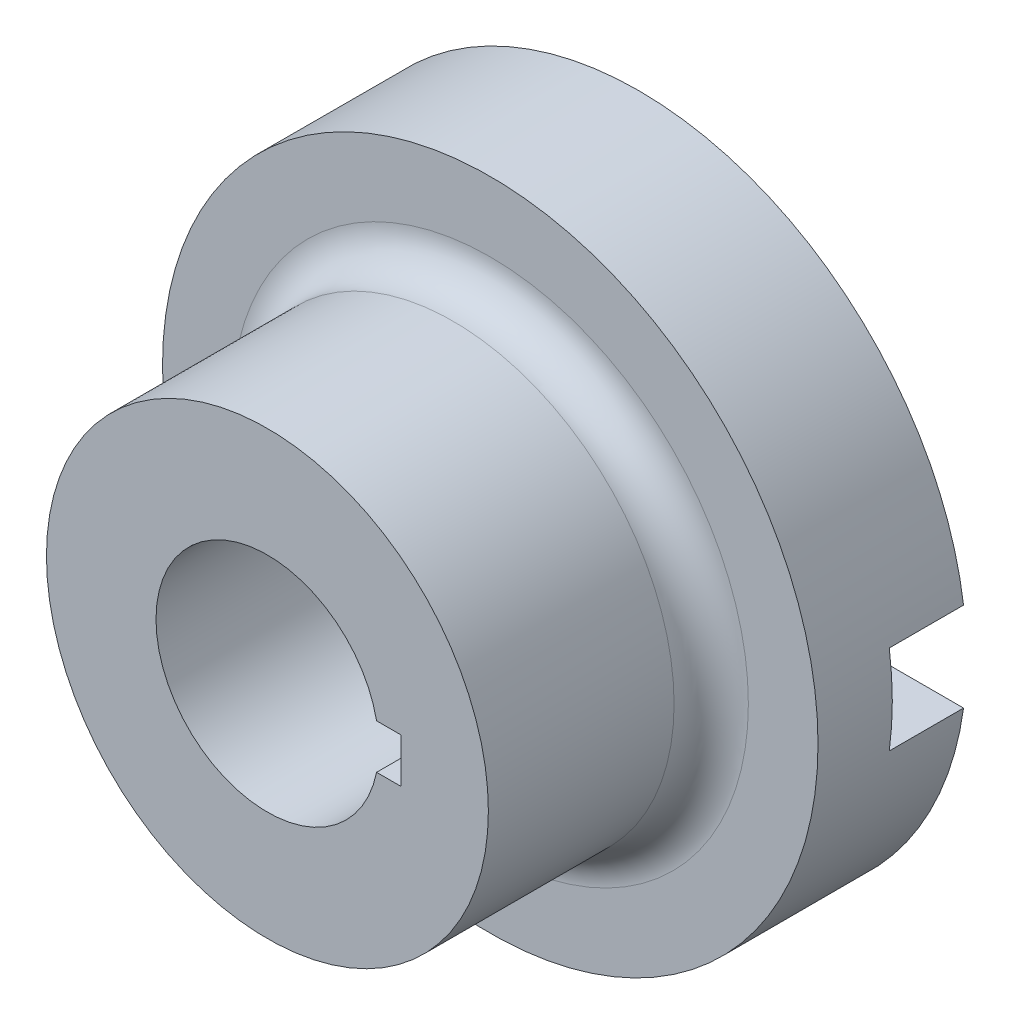
ISO-10303-21;
HEADER;
FILE_DESCRIPTION(('STEP AP214'),'2;1');
FILE_NAME('part.step','',(''),(''),'','','');
FILE_SCHEMA(('AUTOMOTIVE_DESIGN { 1 0 10303 214 1 1 1 1 }'));
ENDSEC;
DATA;
#1=APPLICATION_CONTEXT('core data for automotive mechanical design processes');
#2=APPLICATION_PROTOCOL_DEFINITION('international standard','automotive_design',2000,#1);
#3=PRODUCT_CONTEXT('',#1,'mechanical');
#4=PRODUCT('Part','Part','',(#3));
#5=PRODUCT_RELATED_PRODUCT_CATEGORY('part','',(#4));
#6=PRODUCT_DEFINITION_FORMATION('','',#4);
#7=PRODUCT_DEFINITION_CONTEXT('part definition',#1,'design');
#8=PRODUCT_DEFINITION('design','',#6,#7);
#9=PRODUCT_DEFINITION_SHAPE('','',#8);
#10=(LENGTH_UNIT() NAMED_UNIT(*) SI_UNIT(.MILLI.,.METRE.));
#11=(NAMED_UNIT(*) PLANE_ANGLE_UNIT() SI_UNIT($,.RADIAN.));
#12=(NAMED_UNIT(*) SI_UNIT($,.STERADIAN.) SOLID_ANGLE_UNIT());
#13=UNCERTAINTY_MEASURE_WITH_UNIT(LENGTH_MEASURE(1.E-05),#10,'distance_accuracy_value','');
#14=(GEOMETRIC_REPRESENTATION_CONTEXT(3) GLOBAL_UNCERTAINTY_ASSIGNED_CONTEXT((#13)) GLOBAL_UNIT_ASSIGNED_CONTEXT((#10,
#11,#12)) REPRESENTATION_CONTEXT('',''));
#15=CARTESIAN_POINT('',(0.,0.,0.));
#16=DIRECTION('',(0.,0.,1.));
#17=DIRECTION('',(1.,0.,0.));
#18=AXIS2_PLACEMENT_3D('',#15,#16,#17);
#19=CARTESIAN_POINT('',(0.,15.,0.));
#20=DIRECTION('',(0.,0.,-1.));
#21=DIRECTION('',(-1.,0.,0.));
#22=AXIS2_PLACEMENT_3D('',#19,#20,#21);
#23=PLANE('',#22);
#24=DIRECTION('',(-1.,0.,0.));
#25=VECTOR('',#24,1.);
#26=CARTESIAN_POINT('',(59.157364073144,-6.,0.));
#27=LINE('',#26,#25);
#28=CARTESIAN_POINT('',(43.7145832655232,-6.,0.));
#29=VERTEX_POINT('',#28);
#30=CARTESIAN_POINT('',(13.7477270848675,-6.,0.));
#31=VERTEX_POINT('',#30);
#32=EDGE_CURVE('E153',#29,#31,#27,.T.);
#33=ORIENTED_EDGE('',*,*,#32,.F.);
#34=CARTESIAN_POINT('',(0.,0.,0.));
#35=DIRECTION('',(0.,0.,-1.));
#36=DIRECTION('',(-1.,0.,0.));
#37=AXIS2_PLACEMENT_3D('',#34,#35,#36);
#38=CIRCLE('',#37,44.1244239631336);
#39=CARTESIAN_POINT('',(-43.7145832655232,-6.,0.));
#40=VERTEX_POINT('',#39);
#41=EDGE_CURVE('E183',#29,#40,#38,.T.);
#42=ORIENTED_EDGE('',*,*,#41,.T.);
#43=CARTESIAN_POINT('',(-13.7477270848675,-6.,0.));
#44=VERTEX_POINT('',#43);
#45=EDGE_CURVE('E159',#44,#40,#27,.T.);
#46=ORIENTED_EDGE('',*,*,#45,.F.);
#47=CARTESIAN_POINT('',(0.,0.,0.));
#48=DIRECTION('',(0.,0.,-1.));
#49=DIRECTION('',(-1.,0.,0.));
#50=AXIS2_PLACEMENT_3D('',#47,#48,#49);
#51=CIRCLE('',#50,15.);
#52=EDGE_CURVE('E187',#31,#44,#51,.T.);
#53=ORIENTED_EDGE('',*,*,#52,.F.);
#54=EDGE_LOOP('',(#33,#42,#46,#53));
#55=FACE_BOUND('',#54,.T.);
#56=ADVANCED_FACE('F33',(#55),#23,.T.);
#57=CARTESIAN_POINT('',(0.,0.,0.));
#58=DIRECTION('',(0.,0.,-1.));
#59=DIRECTION('',(-1.,0.,0.));
#60=AXIS2_PLACEMENT_3D('',#57,#58,#59);
#61=CYLINDRICAL_SURFACE('',#60,15.);
#62=DIRECTION('',(0.,0.,-1.));
#63=VECTOR('',#62,1.);
#64=CARTESIAN_POINT('',(14.6969384566991,3.,0.));
#65=LINE('',#64,#63);
#66=CARTESIAN_POINT('',(14.6969384566991,3.,50.));
#67=VERTEX_POINT('',#66);
#68=CARTESIAN_POINT('',(14.6969384566991,3.,10.));
#69=VERTEX_POINT('',#68);
#70=EDGE_CURVE('E148',#67,#69,#65,.T.);
#71=ORIENTED_EDGE('',*,*,#70,.F.);
#72=CARTESIAN_POINT('',(0.,0.,50.));
#73=DIRECTION('',(0.,0.,-1.));
#74=DIRECTION('',(-1.,0.,0.));
#75=AXIS2_PLACEMENT_3D('',#72,#73,#74);
#76=CIRCLE('',#75,15.);
#77=CARTESIAN_POINT('',(14.6969384566991,-3.,50.));
#78=VERTEX_POINT('',#77);
#79=EDGE_CURVE('E175',#78,#67,#76,.T.);
#80=ORIENTED_EDGE('',*,*,#79,.F.);
#81=DIRECTION('',(0.,0.,-1.));
#82=VECTOR('',#81,1.);
#83=CARTESIAN_POINT('',(14.6969384566991,-3.,0.));
#84=LINE('',#83,#82);
#85=CARTESIAN_POINT('',(14.6969384566991,-3.,10.));
#86=VERTEX_POINT('',#85);
#87=EDGE_CURVE('E136',#86,#78,#84,.F.);
#88=ORIENTED_EDGE('',*,*,#87,.F.);
#89=CARTESIAN_POINT('',(0.,0.,10.));
#90=DIRECTION('',(0.,0.,-1.));
#91=DIRECTION('',(-1.,0.,0.));
#92=AXIS2_PLACEMENT_3D('',#89,#90,#91);
#93=CIRCLE('',#92,15.);
#94=CARTESIAN_POINT('',(13.7477270848675,-6.,10.));
#95=VERTEX_POINT('',#94);
#96=EDGE_CURVE('E164',#86,#95,#93,.T.);
#97=ORIENTED_EDGE('',*,*,#96,.T.);
#98=DIRECTION('',(0.,0.,-1.));
#99=VECTOR('',#98,1.);
#100=CARTESIAN_POINT('',(13.7477270848675,-6.,0.));
#101=LINE('',#100,#99);
#102=EDGE_CURVE('E170',#31,#95,#101,.F.);
#103=ORIENTED_EDGE('',*,*,#102,.F.);
#104=ORIENTED_EDGE('',*,*,#52,.T.);
#105=DIRECTION('',(0.,0.,-1.));
#106=VECTOR('',#105,1.);
#107=CARTESIAN_POINT('',(-13.7477270848675,-6.,0.));
#108=LINE('',#107,#106);
#109=CARTESIAN_POINT('',(-13.7477270848675,-6.,10.));
#110=VERTEX_POINT('',#109);
#111=EDGE_CURVE('E173',#110,#44,#108,.T.);
#112=ORIENTED_EDGE('',*,*,#111,.F.);
#113=CARTESIAN_POINT('',(-13.7477270848675,6.,10.));
#114=VERTEX_POINT('',#113);
#115=EDGE_CURVE('E161',#110,#114,#93,.T.);
#116=ORIENTED_EDGE('',*,*,#115,.T.);
#117=DIRECTION('',(0.,0.,-1.));
#118=VECTOR('',#117,1.);
#119=CARTESIAN_POINT('',(-13.7477270848675,6.,0.));
#120=LINE('',#119,#118);
#121=CARTESIAN_POINT('',(-13.7477270848675,6.,0.));
#122=VERTEX_POINT('',#121);
#123=EDGE_CURVE('E166',#122,#114,#120,.F.);
#124=ORIENTED_EDGE('',*,*,#123,.F.);
#125=CARTESIAN_POINT('',(13.7477270848675,6.,0.));
#126=VERTEX_POINT('',#125);
#127=EDGE_CURVE('E188',#122,#126,#51,.T.);
#128=ORIENTED_EDGE('',*,*,#127,.T.);
#129=DIRECTION('',(0.,0.,-1.));
#130=VECTOR('',#129,1.);
#131=CARTESIAN_POINT('',(13.7477270848675,6.,0.));
#132=LINE('',#131,#130);
#133=CARTESIAN_POINT('',(13.7477270848675,6.,10.));
#134=VERTEX_POINT('',#133);
#135=EDGE_CURVE('E168',#134,#126,#132,.T.);
#136=ORIENTED_EDGE('',*,*,#135,.F.);
#137=EDGE_CURVE('E165',#134,#69,#93,.T.);
#138=ORIENTED_EDGE('',*,*,#137,.T.);
#139=EDGE_LOOP('',(#71,#80,#88,#97,#103,#104,#112,#116,#124,#128,#136,#138));
#140=FACE_BOUND('',#139,.T.);
#141=ADVANCED_FACE('F222',(#140),#61,.F.);
#142=DIRECTION('',(1.,0.,0.));
#143=VECTOR('',#142,1.);
#144=CARTESIAN_POINT('',(59.157364073144,6.,0.));
#145=LINE('',#144,#143);
#146=CARTESIAN_POINT('',(-43.7145832655232,6.,0.));
#147=VERTEX_POINT('',#146);
#148=EDGE_CURVE('E158',#147,#122,#145,.T.);
#149=ORIENTED_EDGE('',*,*,#148,.F.);
#150=CARTESIAN_POINT('',(43.7145832655232,6.,0.));
#151=VERTEX_POINT('',#150);
#152=EDGE_CURVE('E184',#147,#151,#38,.T.);
#153=ORIENTED_EDGE('',*,*,#152,.T.);
#154=EDGE_CURVE('E150',#126,#151,#145,.T.);
#155=ORIENTED_EDGE('',*,*,#154,.F.);
#156=ORIENTED_EDGE('',*,*,#127,.F.);
#157=EDGE_LOOP('',(#149,#153,#155,#156));
#158=FACE_BOUND('',#157,.T.);
#159=ADVANCED_FACE('F225',(#158),#23,.T.);
#160=CARTESIAN_POINT('',(0.,0.,0.));
#161=DIRECTION('',(0.,0.,-1.));
#162=DIRECTION('',(-1.,0.,0.));
#163=AXIS2_PLACEMENT_3D('',#160,#161,#162);
#164=CYLINDRICAL_SURFACE('',#163,44.1244239631336);
#165=DIRECTION('',(0.,0.,-1.));
#166=VECTOR('',#165,1.);
#167=CARTESIAN_POINT('',(43.7145832655232,-6.,0.));
#168=LINE('',#167,#166);
#169=CARTESIAN_POINT('',(43.7145832655232,-6.,10.));
#170=VERTEX_POINT('',#169);
#171=EDGE_CURVE('E202',#170,#29,#168,.T.);
#172=ORIENTED_EDGE('',*,*,#171,.F.);
#173=CARTESIAN_POINT('',(0.,0.,10.));
#174=DIRECTION('',(0.,0.,-1.));
#175=DIRECTION('',(-1.,0.,0.));
#176=AXIS2_PLACEMENT_3D('',#173,#174,#175);
#177=CIRCLE('',#176,44.1244239631336);
#178=CARTESIAN_POINT('',(43.7145832655232,6.,10.));
#179=VERTEX_POINT('',#178);
#180=EDGE_CURVE('E195',#170,#179,#177,.F.);
#181=ORIENTED_EDGE('',*,*,#180,.T.);
#182=DIRECTION('',(0.,0.,-1.));
#183=VECTOR('',#182,1.);
#184=CARTESIAN_POINT('',(43.7145832655232,6.,0.));
#185=LINE('',#184,#183);
#186=EDGE_CURVE('E200',#151,#179,#185,.F.);
#187=ORIENTED_EDGE('',*,*,#186,.F.);
#188=ORIENTED_EDGE('',*,*,#152,.F.);
#189=DIRECTION('',(0.,0.,-1.));
#190=VECTOR('',#189,1.);
#191=CARTESIAN_POINT('',(-43.7145832655232,6.,0.));
#192=LINE('',#191,#190);
#193=CARTESIAN_POINT('',(-43.7145832655232,6.,10.));
#194=VERTEX_POINT('',#193);
#195=EDGE_CURVE('E194',#194,#147,#192,.T.);
#196=ORIENTED_EDGE('',*,*,#195,.F.);
#197=CARTESIAN_POINT('',(-43.7145832655232,-6.,10.));
#198=VERTEX_POINT('',#197);
#199=EDGE_CURVE('E191',#194,#198,#177,.F.);
#200=ORIENTED_EDGE('',*,*,#199,.T.);
#201=DIRECTION('',(0.,0.,-1.));
#202=VECTOR('',#201,1.);
#203=CARTESIAN_POINT('',(-43.7145832655232,-6.,0.));
#204=LINE('',#203,#202);
#205=EDGE_CURVE('E197',#40,#198,#204,.F.);
#206=ORIENTED_EDGE('',*,*,#205,.F.);
#207=ORIENTED_EDGE('',*,*,#41,.F.);
#208=EDGE_LOOP('',(#172,#181,#187,#188,#196,#200,#206,#207));
#209=FACE_BOUND('',#208,.T.);
#210=CARTESIAN_POINT('',(0.,0.,20.));
#211=DIRECTION('',(0.,0.,-1.));
#212=DIRECTION('',(-1.,0.,0.));
#213=AXIS2_PLACEMENT_3D('',#210,#211,#212);
#214=CIRCLE('',#213,44.1244239631336);
#215=CARTESIAN_POINT('',(-44.1244239631336,0.,20.));
#216=VERTEX_POINT('',#215);
#217=EDGE_CURVE('E180',#216,#216,#214,.T.);
#218=ORIENTED_EDGE('',*,*,#217,.T.);
#219=EDGE_LOOP('',(#218));
#220=FACE_BOUND('',#219,.T.);
#221=ADVANCED_FACE('F233',(#209,#220),#164,.T.);
#222=CARTESIAN_POINT('',(0.,44.1244239631336,20.));
#223=DIRECTION('',(0.,0.,1.));
#224=DIRECTION('',(1.,0.,0.));
#225=AXIS2_PLACEMENT_3D('',#222,#223,#224);
#226=PLANE('',#225);
#227=CARTESIAN_POINT('',(0.,0.,20.));
#228=DIRECTION('',(0.,0.,1.));
#229=DIRECTION('',(1.,0.,0.));
#230=AXIS2_PLACEMENT_3D('',#227,#228,#229);
#231=CIRCLE('',#230,34.7465437788018);
#232=CARTESIAN_POINT('',(34.7465437788018,0.,20.));
#233=VERTEX_POINT('',#232);
#234=EDGE_CURVE('E41',#233,#233,#231,.F.);
#235=ORIENTED_EDGE('',*,*,#234,.T.);
#236=EDGE_LOOP('',(#235));
#237=FACE_BOUND('',#236,.T.);
#238=ORIENTED_EDGE('',*,*,#217,.F.);
#239=EDGE_LOOP('',(#238));
#240=FACE_BOUND('',#239,.T.);
#241=ADVANCED_FACE('F211',(#237,#240),#226,.T.);
#242=CARTESIAN_POINT('',(0.,0.,0.));
#243=DIRECTION('',(0.,0.,-1.));
#244=DIRECTION('',(-1.,0.,0.));
#245=AXIS2_PLACEMENT_3D('',#242,#243,#244);
#246=CYLINDRICAL_SURFACE('',#245,29.7465437788018);
#247=CARTESIAN_POINT('',(0.,0.,25.));
#248=DIRECTION('',(0.,0.,1.));
#249=DIRECTION('',(1.,0.,0.));
#250=AXIS2_PLACEMENT_3D('',#247,#248,#249);
#251=CIRCLE('',#250,29.7465437788018);
#252=CARTESIAN_POINT('',(29.7465437788018,0.,25.));
#253=VERTEX_POINT('',#252);
#254=EDGE_CURVE('E11',#253,#253,#251,.T.);
#255=ORIENTED_EDGE('',*,*,#254,.T.);
#256=EDGE_LOOP('',(#255));
#257=FACE_BOUND('',#256,.T.);
#258=CARTESIAN_POINT('',(0.,0.,50.));
#259=DIRECTION('',(0.,0.,-1.));
#260=DIRECTION('',(-1.,0.,0.));
#261=AXIS2_PLACEMENT_3D('',#258,#259,#260);
#262=CIRCLE('',#261,29.7465437788018);
#263=CARTESIAN_POINT('',(-29.7465437788018,0.,50.));
#264=VERTEX_POINT('',#263);
#265=EDGE_CURVE('E177',#264,#264,#262,.T.);
#266=ORIENTED_EDGE('',*,*,#265,.T.);
#267=EDGE_LOOP('',(#266));
#268=FACE_BOUND('',#267,.T.);
#269=ADVANCED_FACE('F295',(#257,#268),#246,.T.);
#270=CARTESIAN_POINT('',(0.,29.7465437788018,50.));
#271=DIRECTION('',(0.,0.,1.));
#272=DIRECTION('',(1.,0.,0.));
#273=AXIS2_PLACEMENT_3D('',#270,#271,#272);
#274=PLANE('',#273);
#275=DIRECTION('',(-1.,0.,0.));
#276=VECTOR('',#275,1.);
#277=CARTESIAN_POINT('',(14.,3.,50.));
#278=LINE('',#277,#276);
#279=CARTESIAN_POINT('',(18.,3.,50.));
#280=VERTEX_POINT('',#279);
#281=EDGE_CURVE('E130',#280,#67,#278,.T.);
#282=ORIENTED_EDGE('',*,*,#281,.F.);
#283=DIRECTION('',(0.,1.,0.));
#284=VECTOR('',#283,1.);
#285=CARTESIAN_POINT('',(18.,3.,50.));
#286=LINE('',#285,#284);
#287=CARTESIAN_POINT('',(18.,-3.,50.));
#288=VERTEX_POINT('',#287);
#289=EDGE_CURVE('E124',#288,#280,#286,.T.);
#290=ORIENTED_EDGE('',*,*,#289,.F.);
#291=DIRECTION('',(1.,0.,0.));
#292=VECTOR('',#291,1.);
#293=CARTESIAN_POINT('',(14.,-3.,50.));
#294=LINE('',#293,#292);
#295=EDGE_CURVE('E133',#78,#288,#294,.T.);
#296=ORIENTED_EDGE('',*,*,#295,.F.);
#297=ORIENTED_EDGE('',*,*,#79,.T.);
#298=EDGE_LOOP('',(#282,#290,#296,#297));
#299=FACE_BOUND('',#298,.T.);
#300=ORIENTED_EDGE('',*,*,#265,.F.);
#301=EDGE_LOOP('',(#300));
#302=FACE_BOUND('',#301,.T.);
#303=ADVANCED_FACE('F141',(#299,#302),#274,.T.);
#304=CARTESIAN_POINT('',(0.,0.,10.));
#305=DIRECTION('',(0.,0.,-1.));
#306=DIRECTION('',(-1.,0.,0.));
#307=AXIS2_PLACEMENT_3D('',#304,#305,#306);
#308=PLANE('',#307);
#309=DIRECTION('',(-1.,0.,0.));
#310=VECTOR('',#309,1.);
#311=CARTESIAN_POINT('',(59.157364073144,-6.,10.));
#312=LINE('',#311,#310);
#313=EDGE_CURVE('E154',#110,#198,#312,.T.);
#314=ORIENTED_EDGE('',*,*,#313,.T.);
#315=ORIENTED_EDGE('',*,*,#199,.F.);
#316=DIRECTION('',(1.,0.,0.));
#317=VECTOR('',#316,1.);
#318=CARTESIAN_POINT('',(59.157364073144,6.,10.));
#319=LINE('',#318,#317);
#320=EDGE_CURVE('E152',#194,#114,#319,.T.);
#321=ORIENTED_EDGE('',*,*,#320,.T.);
#322=ORIENTED_EDGE('',*,*,#115,.F.);
#323=EDGE_LOOP('',(#314,#315,#321,#322));
#324=FACE_BOUND('',#323,.T.);
#325=ADVANCED_FACE('F260',(#324),#308,.T.);
#326=CARTESIAN_POINT('',(59.157364073144,6.,10.));
#327=DIRECTION('',(0.,1.,0.));
#328=DIRECTION('',(0.,0.,1.));
#329=AXIS2_PLACEMENT_3D('',#326,#327,#328);
#330=PLANE('',#329);
#331=ORIENTED_EDGE('',*,*,#123,.T.);
#332=ORIENTED_EDGE('',*,*,#320,.F.);
#333=ORIENTED_EDGE('',*,*,#195,.T.);
#334=ORIENTED_EDGE('',*,*,#148,.T.);
#335=EDGE_LOOP('',(#331,#332,#333,#334));
#336=FACE_BOUND('',#335,.T.);
#337=ADVANCED_FACE('F258',(#336),#330,.F.);
#338=CARTESIAN_POINT('',(59.157364073144,-6.,10.));
#339=DIRECTION('',(0.,-1.,0.));
#340=DIRECTION('',(0.,0.,-1.));
#341=AXIS2_PLACEMENT_3D('',#338,#339,#340);
#342=PLANE('',#341);
#343=ORIENTED_EDGE('',*,*,#111,.T.);
#344=ORIENTED_EDGE('',*,*,#45,.T.);
#345=ORIENTED_EDGE('',*,*,#205,.T.);
#346=ORIENTED_EDGE('',*,*,#313,.F.);
#347=EDGE_LOOP('',(#343,#344,#345,#346));
#348=FACE_BOUND('',#347,.T.);
#349=ADVANCED_FACE('F287',(#348),#342,.F.);
#350=ORIENTED_EDGE('',*,*,#135,.T.);
#351=ORIENTED_EDGE('',*,*,#154,.T.);
#352=ORIENTED_EDGE('',*,*,#186,.T.);
#353=EDGE_CURVE('E56',#134,#179,#319,.T.);
#354=ORIENTED_EDGE('',*,*,#353,.F.);
#355=EDGE_LOOP('',(#350,#351,#352,#354));
#356=FACE_BOUND('',#355,.T.);
#357=ADVANCED_FACE('F251',(#356),#330,.F.);
#358=DIRECTION('',(1.,0.,0.));
#359=VECTOR('',#358,1.);
#360=CARTESIAN_POINT('',(0.,3.,10.));
#361=LINE('',#360,#359);
#362=CARTESIAN_POINT('',(18.,3.,10.));
#363=VERTEX_POINT('',#362);
#364=EDGE_CURVE('E207',#69,#363,#361,.T.);
#365=ORIENTED_EDGE('',*,*,#364,.F.);
#366=ORIENTED_EDGE('',*,*,#137,.F.);
#367=ORIENTED_EDGE('',*,*,#353,.T.);
#368=ORIENTED_EDGE('',*,*,#180,.F.);
#369=EDGE_CURVE('E156',#170,#95,#312,.T.);
#370=ORIENTED_EDGE('',*,*,#369,.T.);
#371=ORIENTED_EDGE('',*,*,#96,.F.);
#372=DIRECTION('',(-1.,0.,0.));
#373=VECTOR('',#372,1.);
#374=CARTESIAN_POINT('',(0.,-3.,10.));
#375=LINE('',#374,#373);
#376=CARTESIAN_POINT('',(18.,-3.,10.));
#377=VERTEX_POINT('',#376);
#378=EDGE_CURVE('E204',#377,#86,#375,.T.);
#379=ORIENTED_EDGE('',*,*,#378,.F.);
#380=DIRECTION('',(0.,-1.,0.));
#381=VECTOR('',#380,1.);
#382=CARTESIAN_POINT('',(18.,0.,10.));
#383=LINE('',#382,#381);
#384=EDGE_CURVE('E127',#363,#377,#383,.T.);
#385=ORIENTED_EDGE('',*,*,#384,.F.);
#386=EDGE_LOOP('',(#365,#366,#367,#368,#370,#371,#379,#385));
#387=FACE_BOUND('',#386,.T.);
#388=ADVANCED_FACE('F276',(#387),#308,.T.);
#389=ORIENTED_EDGE('',*,*,#102,.T.);
#390=ORIENTED_EDGE('',*,*,#369,.F.);
#391=ORIENTED_EDGE('',*,*,#171,.T.);
#392=ORIENTED_EDGE('',*,*,#32,.T.);
#393=EDGE_LOOP('',(#389,#390,#391,#392));
#394=FACE_BOUND('',#393,.T.);
#395=ADVANCED_FACE('F271',(#394),#342,.F.);
#396=CARTESIAN_POINT('',(14.,3.,0.));
#397=DIRECTION('',(0.,1.,0.));
#398=DIRECTION('',(0.,0.,1.));
#399=AXIS2_PLACEMENT_3D('',#396,#397,#398);
#400=PLANE('',#399);
#401=ORIENTED_EDGE('',*,*,#70,.T.);
#402=ORIENTED_EDGE('',*,*,#364,.T.);
#403=DIRECTION('',(0.,0.,1.));
#404=VECTOR('',#403,1.);
#405=CARTESIAN_POINT('',(18.,3.,0.));
#406=LINE('',#405,#404);
#407=EDGE_CURVE('E129',#363,#280,#406,.T.);
#408=ORIENTED_EDGE('',*,*,#407,.T.);
#409=ORIENTED_EDGE('',*,*,#281,.T.);
#410=EDGE_LOOP('',(#401,#402,#408,#409));
#411=FACE_BOUND('',#410,.T.);
#412=ADVANCED_FACE('F278',(#411),#400,.F.);
#413=CARTESIAN_POINT('',(18.,3.,0.));
#414=DIRECTION('',(1.,0.,0.));
#415=DIRECTION('',(0.,0.,-1.));
#416=AXIS2_PLACEMENT_3D('',#413,#414,#415);
#417=PLANE('',#416);
#418=ORIENTED_EDGE('',*,*,#384,.T.);
#419=DIRECTION('',(0.,0.,1.));
#420=VECTOR('',#419,1.);
#421=CARTESIAN_POINT('',(18.,-3.,0.));
#422=LINE('',#421,#420);
#423=EDGE_CURVE('E48',#377,#288,#422,.T.);
#424=ORIENTED_EDGE('',*,*,#423,.T.);
#425=ORIENTED_EDGE('',*,*,#289,.T.);
#426=ORIENTED_EDGE('',*,*,#407,.F.);
#427=EDGE_LOOP('',(#418,#424,#425,#426));
#428=FACE_BOUND('',#427,.T.);
#429=ADVANCED_FACE('F121',(#428),#417,.F.);
#430=CARTESIAN_POINT('',(14.,-3.,0.));
#431=DIRECTION('',(0.,-1.,0.));
#432=DIRECTION('',(0.,0.,-1.));
#433=AXIS2_PLACEMENT_3D('',#430,#431,#432);
#434=PLANE('',#433);
#435=ORIENTED_EDGE('',*,*,#87,.T.);
#436=ORIENTED_EDGE('',*,*,#295,.T.);
#437=ORIENTED_EDGE('',*,*,#423,.F.);
#438=ORIENTED_EDGE('',*,*,#378,.T.);
#439=EDGE_LOOP('',(#435,#436,#437,#438));
#440=FACE_BOUND('',#439,.T.);
#441=ADVANCED_FACE('F134',(#440),#434,.F.);
#442=CARTESIAN_POINT('',(0.,0.,25.));
#443=DIRECTION('',(0.,0.,1.));
#444=DIRECTION('',(1.,0.,0.));
#445=AXIS2_PLACEMENT_3D('',#442,#443,#444);
#446=TOROIDAL_SURFACE('',#445,34.7465437788018,5.);
#447=ORIENTED_EDGE('',*,*,#254,.F.);
#448=EDGE_LOOP('',(#447));
#449=FACE_BOUND('',#448,.T.);
#450=ORIENTED_EDGE('',*,*,#234,.F.);
#451=EDGE_LOOP('',(#450));
#452=FACE_BOUND('',#451,.T.);
#453=ADVANCED_FACE('F35',(#449,#452),#446,.F.);
#454=CLOSED_SHELL('',(#56,#141,#159,#221,#241,#269,#303,#325,#337,#349,#357,#388,#395,#412,#429,
#441,#453));
#455=MANIFOLD_SOLID_BREP('B2',#454);
#456=ADVANCED_BREP_SHAPE_REPRESENTATION('',(#18,#455),#14);
#457=SHAPE_DEFINITION_REPRESENTATION(#9,#456);
ENDSEC;
END-ISO-10303-21;
